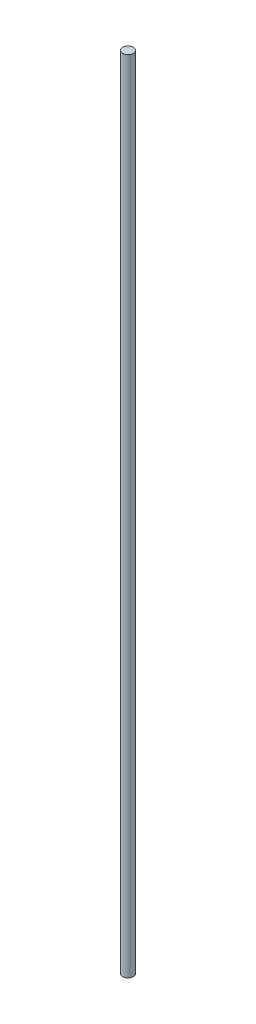
ISO-10303-21;
HEADER;
FILE_DESCRIPTION(('STEP AP214'),'2;1');
FILE_NAME('part.step','',(''),(''),'','','');
FILE_SCHEMA(('AUTOMOTIVE_DESIGN { 1 0 10303 214 1 1 1 1 }'));
ENDSEC;
DATA;
#1=APPLICATION_CONTEXT('core data for automotive mechanical design processes');
#2=APPLICATION_PROTOCOL_DEFINITION('international standard','automotive_design',2000,#1);
#3=PRODUCT_CONTEXT('',#1,'mechanical');
#4=PRODUCT('Part','Part','',(#3));
#5=PRODUCT_RELATED_PRODUCT_CATEGORY('part','',(#4));
#6=PRODUCT_DEFINITION_FORMATION('','',#4);
#7=PRODUCT_DEFINITION_CONTEXT('part definition',#1,'design');
#8=PRODUCT_DEFINITION('design','',#6,#7);
#9=PRODUCT_DEFINITION_SHAPE('','',#8);
#10=(LENGTH_UNIT() NAMED_UNIT(*) SI_UNIT(.MILLI.,.METRE.));
#11=(NAMED_UNIT(*) PLANE_ANGLE_UNIT() SI_UNIT($,.RADIAN.));
#12=(NAMED_UNIT(*) SI_UNIT($,.STERADIAN.) SOLID_ANGLE_UNIT());
#13=UNCERTAINTY_MEASURE_WITH_UNIT(LENGTH_MEASURE(1.E-05),#10,'distance_accuracy_value','');
#14=(GEOMETRIC_REPRESENTATION_CONTEXT(3) GLOBAL_UNCERTAINTY_ASSIGNED_CONTEXT((#13)) GLOBAL_UNIT_ASSIGNED_CONTEXT((#10,
#11,#12)) REPRESENTATION_CONTEXT('',''));
#15=CARTESIAN_POINT('',(0.,0.,0.));
#16=DIRECTION('',(0.,0.,1.));
#17=DIRECTION('',(1.,0.,0.));
#18=AXIS2_PLACEMENT_3D('',#15,#16,#17);
#19=CARTESIAN_POINT('',(0.,60.8,0.));
#20=DIRECTION('',(0.,-1.,0.));
#21=DIRECTION('',(0.,0.,-1.));
#22=AXIS2_PLACEMENT_3D('',#19,#20,#21);
#23=CYLINDRICAL_SURFACE('',#22,0.405);
#24=CARTESIAN_POINT('',(0.,60.8,0.));
#25=DIRECTION('',(0.,1.,0.));
#26=DIRECTION('',(0.,0.,1.));
#27=AXIS2_PLACEMENT_3D('',#24,#25,#26);
#28=CIRCLE('',#27,0.405);
#29=CARTESIAN_POINT('',(0.,60.8,0.405));
#30=VERTEX_POINT('',#29);
#31=EDGE_CURVE('E10',#30,#30,#28,.T.);
#32=ORIENTED_EDGE('',*,*,#31,.F.);
#33=EDGE_LOOP('',(#32));
#34=FACE_BOUND('',#33,.T.);
#35=CARTESIAN_POINT('',(0.,0.,0.));
#36=DIRECTION('',(0.,1.,0.));
#37=DIRECTION('',(0.,0.,1.));
#38=AXIS2_PLACEMENT_3D('',#35,#36,#37);
#39=CIRCLE('',#38,0.405);
#40=CARTESIAN_POINT('',(0.,0.,0.405));
#41=VERTEX_POINT('',#40);
#42=EDGE_CURVE('E40',#41,#41,#39,.T.);
#43=ORIENTED_EDGE('',*,*,#42,.T.);
#44=EDGE_LOOP('',(#43));
#45=FACE_BOUND('',#44,.T.);
#46=ADVANCED_FACE('F37',(#34,#45),#23,.T.);
#47=CARTESIAN_POINT('',(0.,60.8,0.));
#48=DIRECTION('',(0.,1.,0.));
#49=DIRECTION('',(0.,0.,1.));
#50=AXIS2_PLACEMENT_3D('',#47,#48,#49);
#51=PLANE('',#50);
#52=ORIENTED_EDGE('',*,*,#31,.T.);
#53=EDGE_LOOP('',(#52));
#54=FACE_BOUND('',#53,.T.);
#55=ADVANCED_FACE('F54',(#54),#51,.T.);
#56=CARTESIAN_POINT('',(0.,0.,0.));
#57=DIRECTION('',(0.,1.,0.));
#58=DIRECTION('',(0.,0.,1.));
#59=AXIS2_PLACEMENT_3D('',#56,#57,#58);
#60=PLANE('',#59);
#61=ORIENTED_EDGE('',*,*,#42,.F.);
#62=EDGE_LOOP('',(#61));
#63=FACE_BOUND('',#62,.T.);
#64=ADVANCED_FACE('F52',(#63),#60,.F.);
#65=CLOSED_SHELL('',(#46,#55,#64));
#66=MANIFOLD_SOLID_BREP('B2',#65);
#67=ADVANCED_BREP_SHAPE_REPRESENTATION('',(#18,#66),#14);
#68=SHAPE_DEFINITION_REPRESENTATION(#9,#67);
ENDSEC;
END-ISO-10303-21;
